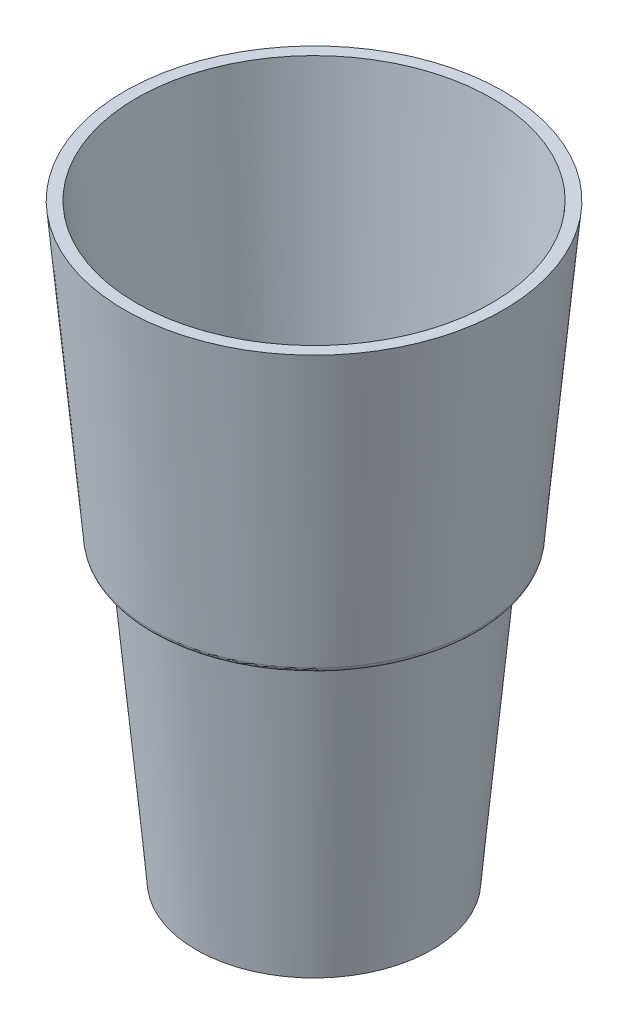
ISO-10303-21;
HEADER;
FILE_DESCRIPTION(('STEP AP214'),'2;1');
FILE_NAME('part.step','',(''),(''),'','','');
FILE_SCHEMA(('AUTOMOTIVE_DESIGN { 1 0 10303 214 1 1 1 1 }'));
ENDSEC;
DATA;
#1=APPLICATION_CONTEXT('core data for automotive mechanical design processes');
#2=APPLICATION_PROTOCOL_DEFINITION('international standard','automotive_design',2000,#1);
#3=PRODUCT_CONTEXT('',#1,'mechanical');
#4=PRODUCT('Part','Part','',(#3));
#5=PRODUCT_RELATED_PRODUCT_CATEGORY('part','',(#4));
#6=PRODUCT_DEFINITION_FORMATION('','',#4);
#7=PRODUCT_DEFINITION_CONTEXT('part definition',#1,'design');
#8=PRODUCT_DEFINITION('design','',#6,#7);
#9=PRODUCT_DEFINITION_SHAPE('','',#8);
#10=(LENGTH_UNIT() NAMED_UNIT(*) SI_UNIT(.MILLI.,.METRE.));
#11=(NAMED_UNIT(*) PLANE_ANGLE_UNIT() SI_UNIT($,.RADIAN.));
#12=(NAMED_UNIT(*) SI_UNIT($,.STERADIAN.) SOLID_ANGLE_UNIT());
#13=UNCERTAINTY_MEASURE_WITH_UNIT(LENGTH_MEASURE(1.E-05),#10,'distance_accuracy_value','');
#14=(GEOMETRIC_REPRESENTATION_CONTEXT(3) GLOBAL_UNCERTAINTY_ASSIGNED_CONTEXT((#13)) GLOBAL_UNIT_ASSIGNED_CONTEXT((#10,
#11,#12)) REPRESENTATION_CONTEXT('',''));
#15=CARTESIAN_POINT('',(0.,0.,0.));
#16=DIRECTION('',(0.,0.,1.));
#17=DIRECTION('',(1.,0.,0.));
#18=AXIS2_PLACEMENT_3D('',#15,#16,#17);
#19=CARTESIAN_POINT('',(0.,0.,0.));
#20=DIRECTION('',(0.,-1.,0.));
#21=DIRECTION('',(0.,0.,-1.));
#22=AXIS2_PLACEMENT_3D('',#19,#20,#21);
#23=PLANE('',#22);
#24=CARTESIAN_POINT('',(0.,0.,0.));
#25=DIRECTION('',(0.,-1.,0.));
#26=DIRECTION('',(0.,0.,-1.));
#27=AXIS2_PLACEMENT_3D('',#24,#25,#26);
#28=CIRCLE('',#27,25.4);
#29=CARTESIAN_POINT('',(0.,0.,-25.4));
#30=VERTEX_POINT('',#29);
#31=EDGE_CURVE('E54',#30,#30,#28,.T.);
#32=ORIENTED_EDGE('',*,*,#31,.T.);
#33=EDGE_LOOP('',(#32));
#34=FACE_BOUND('',#33,.T.);
#35=ADVANCED_FACE('F34',(#34),#23,.T.);
#36=CARTESIAN_POINT('',(0.,0.,0.));
#37=DIRECTION('',(0.,1.,0.));
#38=DIRECTION('',(0.,0.,1.));
#39=AXIS2_PLACEMENT_3D('',#36,#37,#38);
#40=CONICAL_SURFACE('',#39,25.4,0.090865272289573);
#41=CARTESIAN_POINT('',(0.,62.3452401628977,0.));
#42=DIRECTION('',(0.,1.,0.));
#43=DIRECTION('',(0.,0.,1.));
#44=AXIS2_PLACEMENT_3D('',#41,#42,#43);
#45=CIRCLE('',#44,31.0806599543019);
#46=CARTESIAN_POINT('',(0.,62.3452401628977,31.0806599543019));
#47=VERTEX_POINT('',#46);
#48=EDGE_CURVE('E10',#47,#47,#45,.F.);
#49=ORIENTED_EDGE('',*,*,#48,.T.);
#50=EDGE_LOOP('',(#49));
#51=FACE_BOUND('',#50,.T.);
#52=ORIENTED_EDGE('',*,*,#31,.F.);
#53=EDGE_LOOP('',(#52));
#54=FACE_BOUND('',#53,.T.);
#55=ADVANCED_FACE('F91',(#51,#54),#40,.T.);
#56=CARTESIAN_POINT('',(31.1858772563177,63.5,0.));
#57=DIRECTION('',(0.,-1.,0.));
#58=DIRECTION('',(0.,0.,-1.));
#59=AXIS2_PLACEMENT_3D('',#56,#57,#58);
#60=PLANE('',#59);
#61=CARTESIAN_POINT('',(0.,63.5,0.));
#62=DIRECTION('',(0.,-1.,0.));
#63=DIRECTION('',(0.,0.,-1.));
#64=AXIS2_PLACEMENT_3D('',#61,#62,#63);
#65=CIRCLE('',#64,33.8363338280546);
#66=CARTESIAN_POINT('',(0.,63.5,-33.8363338280546));
#67=VERTEX_POINT('',#66);
#68=EDGE_CURVE('E45',#67,#67,#65,.T.);
#69=ORIENTED_EDGE('',*,*,#68,.T.);
#70=EDGE_LOOP('',(#69));
#71=FACE_BOUND('',#70,.T.);
#72=CARTESIAN_POINT('',(0.,63.5,0.));
#73=DIRECTION('',(0.,-1.,0.));
#74=DIRECTION('',(0.,0.,-1.));
#75=AXIS2_PLACEMENT_3D('',#72,#73,#74);
#76=CIRCLE('',#75,32.3454206845807);
#77=CARTESIAN_POINT('',(0.,63.5,-32.3454206845807));
#78=VERTEX_POINT('',#77);
#79=EDGE_CURVE('E49',#78,#78,#76,.F.);
#80=ORIENTED_EDGE('',*,*,#79,.T.);
#81=EDGE_LOOP('',(#80));
#82=FACE_BOUND('',#81,.T.);
#83=ADVANCED_FACE('F97',(#71,#82),#60,.T.);
#84=CARTESIAN_POINT('',(0.,63.5,0.));
#85=DIRECTION('',(0.,1.,0.));
#86=DIRECTION('',(0.,0.,1.));
#87=AXIS2_PLACEMENT_3D('',#84,#85,#86);
#88=CONICAL_SURFACE('',#87,34.9958772563177,0.0908652722895731);
#89=CARTESIAN_POINT('',(0.,64.6547598371023,0.));
#90=DIRECTION('',(0.,-1.,0.));
#91=DIRECTION('',(0.,0.,-1.));
#92=AXIS2_PLACEMENT_3D('',#89,#90,#91);
#93=CIRCLE('',#92,35.1010945583334);
#94=CARTESIAN_POINT('',(0.,64.6547598371023,-35.1010945583334));
#95=VERTEX_POINT('',#94);
#96=EDGE_CURVE('E41',#95,#95,#93,.F.);
#97=ORIENTED_EDGE('',*,*,#96,.T.);
#98=EDGE_LOOP('',(#97));
#99=FACE_BOUND('',#98,.T.);
#100=CARTESIAN_POINT('',(0.,127.,0.));
#101=DIRECTION('',(0.,-1.,0.));
#102=DIRECTION('',(0.,0.,-1.));
#103=AXIS2_PLACEMENT_3D('',#100,#101,#102);
#104=CIRCLE('',#103,40.7817545126354);
#105=CARTESIAN_POINT('',(0.,127.,-40.7817545126354));
#106=VERTEX_POINT('',#105);
#107=EDGE_CURVE('E57',#106,#106,#104,.T.);
#108=ORIENTED_EDGE('',*,*,#107,.T.);
#109=EDGE_LOOP('',(#108));
#110=FACE_BOUND('',#109,.T.);
#111=ADVANCED_FACE('F106',(#99,#110),#88,.T.);
#112=CARTESIAN_POINT('',(40.7817545126354,127.,0.));
#113=DIRECTION('',(0.,1.,0.));
#114=DIRECTION('',(0.,0.,1.));
#115=AXIS2_PLACEMENT_3D('',#112,#113,#114);
#116=PLANE('',#115);
#117=CARTESIAN_POINT('',(0.,127.,0.));
#118=DIRECTION('',(0.,1.,0.));
#119=DIRECTION('',(0.,0.,1.));
#120=AXIS2_PLACEMENT_3D('',#117,#118,#119);
#121=CIRCLE('',#120,38.2312325658566);
#122=CARTESIAN_POINT('',(0.,127.,38.2312325658566));
#123=VERTEX_POINT('',#122);
#124=EDGE_CURVE('E61',#123,#123,#121,.F.);
#125=ORIENTED_EDGE('',*,*,#124,.T.);
#126=EDGE_LOOP('',(#125));
#127=FACE_BOUND('',#126,.T.);
#128=ORIENTED_EDGE('',*,*,#107,.F.);
#129=EDGE_LOOP('',(#128));
#130=FACE_BOUND('',#129,.T.);
#131=ADVANCED_FACE('F101',(#127,#130),#116,.T.);
#132=CARTESIAN_POINT('',(0.,64.77,0.));
#133=DIRECTION('',(0.,-1.,0.));
#134=DIRECTION('',(0.,0.,-1.));
#135=AXIS2_PLACEMENT_3D('',#132,#133,#134);
#136=TOROIDAL_SURFACE('',#135,33.8363338280546,1.27);
#137=ORIENTED_EDGE('',*,*,#96,.F.);
#138=EDGE_LOOP('',(#137));
#139=FACE_BOUND('',#138,.T.);
#140=ORIENTED_EDGE('',*,*,#68,.F.);
#141=EDGE_LOOP('',(#140));
#142=FACE_BOUND('',#141,.T.);
#143=ADVANCED_FACE('F88',(#139,#142),#136,.T.);
#144=CARTESIAN_POINT('',(0.,62.23,0.));
#145=DIRECTION('',(0.,-1.,0.));
#146=DIRECTION('',(0.,0.,-1.));
#147=AXIS2_PLACEMENT_3D('',#144,#145,#146);
#148=TOROIDAL_SURFACE('',#147,32.3454206845807,1.27);
#149=ORIENTED_EDGE('',*,*,#79,.F.);
#150=EDGE_LOOP('',(#149));
#151=FACE_BOUND('',#150,.T.);
#152=ORIENTED_EDGE('',*,*,#48,.F.);
#153=EDGE_LOOP('',(#152));
#154=FACE_BOUND('',#153,.T.);
#155=ADVANCED_FACE('F36',(#151,#154),#148,.F.);
#156=CARTESIAN_POINT('',(0.,2.54,0.));
#157=DIRECTION('',(0.,-1.,0.));
#158=DIRECTION('',(0.,0.,-1.));
#159=AXIS2_PLACEMENT_3D('',#156,#157,#158);
#160=PLANE('',#159);
#161=CARTESIAN_POINT('',(0.,2.54,0.));
#162=DIRECTION('',(0.,-1.,0.));
#163=DIRECTION('',(0.,0.,-1.));
#164=AXIS2_PLACEMENT_3D('',#161,#162,#163);
#165=CIRCLE('',#164,23.0809131434739);
#166=CARTESIAN_POINT('',(0.,2.54,-23.0809131434739));
#167=VERTEX_POINT('',#166);
#168=EDGE_CURVE('E64',#167,#167,#165,.T.);
#169=ORIENTED_EDGE('',*,*,#168,.F.);
#170=EDGE_LOOP('',(#169));
#171=FACE_BOUND('',#170,.T.);
#172=ADVANCED_FACE('F78',(#171),#160,.F.);
#173=CARTESIAN_POINT('',(0.,0.230480325795393,0.));
#174=DIRECTION('',(0.,1.,0.));
#175=DIRECTION('',(0.,0.,1.));
#176=AXIS2_PLACEMENT_3D('',#173,#174,#175);
#177=CONICAL_SURFACE('',#176,22.8704785394424,0.090865272289573);
#178=CARTESIAN_POINT('',(0.,62.5757204886931,0.));
#179=DIRECTION('',(0.,1.,0.));
#180=DIRECTION('',(0.,0.,1.));
#181=AXIS2_PLACEMENT_3D('',#178,#179,#180);
#182=CIRCLE('',#181,28.5511384937444);
#183=CARTESIAN_POINT('',(0.,62.5757204886931,28.5511384937444));
#184=VERTEX_POINT('',#183);
#185=EDGE_CURVE('E60',#184,#184,#182,.F.);
#186=ORIENTED_EDGE('',*,*,#185,.F.);
#187=EDGE_LOOP('',(#186));
#188=FACE_BOUND('',#187,.T.);
#189=ORIENTED_EDGE('',*,*,#168,.T.);
#190=EDGE_LOOP('',(#189));
#191=FACE_BOUND('',#190,.T.);
#192=ADVANCED_FACE('F76',(#188,#191),#177,.F.);
#193=CARTESIAN_POINT('',(31.1858772563177,66.04,0.));
#194=DIRECTION('',(0.,-1.,0.));
#195=DIRECTION('',(0.,0.,-1.));
#196=AXIS2_PLACEMENT_3D('',#193,#194,#195);
#197=PLANE('',#196);
#198=CARTESIAN_POINT('',(0.,66.04,0.));
#199=DIRECTION('',(0.,-1.,0.));
#200=DIRECTION('',(0.,0.,-1.));
#201=AXIS2_PLACEMENT_3D('',#198,#199,#200);
#202=CIRCLE('',#201,32.6767903997916);
#203=CARTESIAN_POINT('',(0.,66.04,-32.6767903997916));
#204=VERTEX_POINT('',#203);
#205=EDGE_CURVE('E65',#204,#204,#202,.T.);
#206=ORIENTED_EDGE('',*,*,#205,.F.);
#207=EDGE_LOOP('',(#206));
#208=FACE_BOUND('',#207,.T.);
#209=CARTESIAN_POINT('',(0.,66.04,0.));
#210=DIRECTION('',(0.,-1.,0.));
#211=DIRECTION('',(0.,0.,-1.));
#212=AXIS2_PLACEMENT_3D('',#209,#210,#211);
#213=CIRCLE('',#212,32.3454206845807);
#214=CARTESIAN_POINT('',(0.,66.04,-32.3454206845807));
#215=VERTEX_POINT('',#214);
#216=EDGE_CURVE('E68',#215,#215,#213,.F.);
#217=ORIENTED_EDGE('',*,*,#216,.F.);
#218=EDGE_LOOP('',(#217));
#219=FACE_BOUND('',#218,.T.);
#220=ADVANCED_FACE('F85',(#208,#219),#197,.F.);
#221=CARTESIAN_POINT('',(0.,63.7304803257954,0.));
#222=DIRECTION('',(0.,1.,0.));
#223=DIRECTION('',(0.,0.,1.));
#224=AXIS2_PLACEMENT_3D('',#221,#222,#223);
#225=CONICAL_SURFACE('',#224,32.4663557957601,0.0908652722895731);
#226=ORIENTED_EDGE('',*,*,#205,.T.);
#227=EDGE_LOOP('',(#226));
#228=FACE_BOUND('',#227,.T.);
#229=ORIENTED_EDGE('',*,*,#124,.F.);
#230=EDGE_LOOP('',(#229));
#231=FACE_BOUND('',#230,.T.);
#232=ADVANCED_FACE('F124',(#228,#231),#225,.F.);
#233=CARTESIAN_POINT('',(0.,62.23,0.));
#234=DIRECTION('',(0.,-1.,0.));
#235=DIRECTION('',(0.,0.,-1.));
#236=AXIS2_PLACEMENT_3D('',#233,#234,#235);
#237=TOROIDAL_SURFACE('',#236,32.3454206845807,3.81);
#238=ORIENTED_EDGE('',*,*,#216,.T.);
#239=EDGE_LOOP('',(#238));
#240=FACE_BOUND('',#239,.T.);
#241=ORIENTED_EDGE('',*,*,#185,.T.);
#242=EDGE_LOOP('',(#241));
#243=FACE_BOUND('',#242,.T.);
#244=ADVANCED_FACE('F121',(#240,#243),#237,.T.);
#245=CLOSED_SHELL('',(#35,#55,#83,#111,#131,#143,#155,#172,#192,#220,#232,#244));
#246=MANIFOLD_SOLID_BREP('B2',#245);
#247=ADVANCED_BREP_SHAPE_REPRESENTATION('',(#18,#246),#14);
#248=SHAPE_DEFINITION_REPRESENTATION(#9,#247);
ENDSEC;
END-ISO-10303-21;
